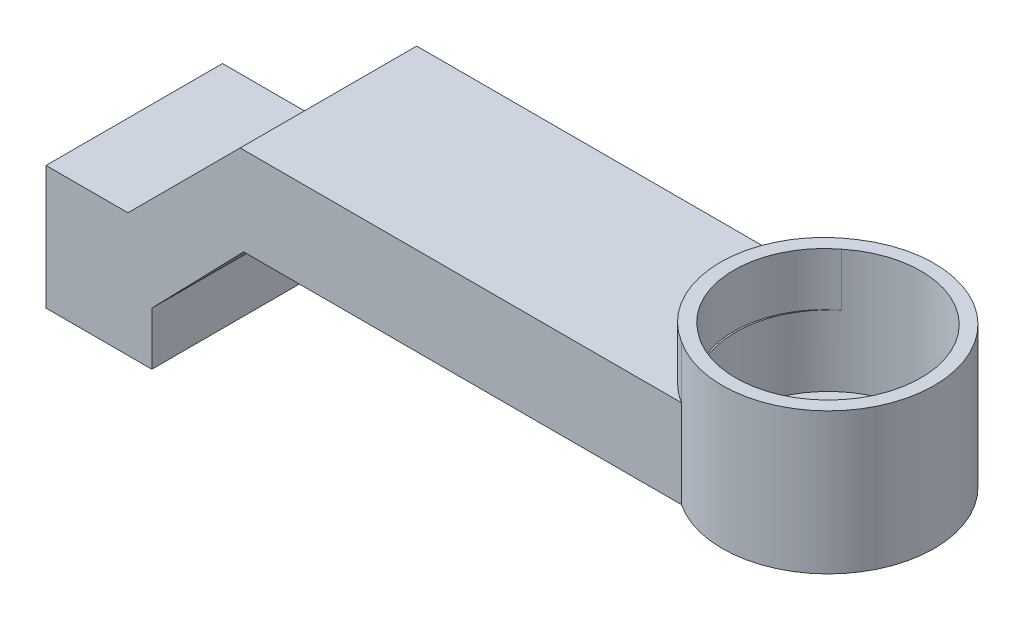
ISO-10303-21;
HEADER;
FILE_DESCRIPTION(('STEP AP214'),'2;1');
FILE_NAME('part.step','',(''),(''),'','','');
FILE_SCHEMA(('AUTOMOTIVE_DESIGN { 1 0 10303 214 1 1 1 1 }'));
ENDSEC;
DATA;
#1=APPLICATION_CONTEXT('core data for automotive mechanical design processes');
#2=APPLICATION_PROTOCOL_DEFINITION('international standard','automotive_design',2000,#1);
#3=PRODUCT_CONTEXT('',#1,'mechanical');
#4=PRODUCT('Part','Part','',(#3));
#5=PRODUCT_RELATED_PRODUCT_CATEGORY('part','',(#4));
#6=PRODUCT_DEFINITION_FORMATION('','',#4);
#7=PRODUCT_DEFINITION_CONTEXT('part definition',#1,'design');
#8=PRODUCT_DEFINITION('design','',#6,#7);
#9=PRODUCT_DEFINITION_SHAPE('','',#8);
#10=(LENGTH_UNIT() NAMED_UNIT(*) SI_UNIT(.MILLI.,.METRE.));
#11=(NAMED_UNIT(*) PLANE_ANGLE_UNIT() SI_UNIT($,.RADIAN.));
#12=(NAMED_UNIT(*) SI_UNIT($,.STERADIAN.) SOLID_ANGLE_UNIT());
#13=UNCERTAINTY_MEASURE_WITH_UNIT(LENGTH_MEASURE(1.E-05),#10,'distance_accuracy_value','');
#14=(GEOMETRIC_REPRESENTATION_CONTEXT(3) GLOBAL_UNCERTAINTY_ASSIGNED_CONTEXT((#13)) GLOBAL_UNIT_ASSIGNED_CONTEXT((#10,
#11,#12)) REPRESENTATION_CONTEXT('',''));
#15=CARTESIAN_POINT('',(0.,0.,0.));
#16=DIRECTION('',(0.,0.,1.));
#17=DIRECTION('',(1.,0.,0.));
#18=AXIS2_PLACEMENT_3D('',#15,#16,#17);
#19=CARTESIAN_POINT('',(6.476,10.358,10.));
#20=DIRECTION('',(0.,-1.,0.));
#21=DIRECTION('',(0.,0.,-1.));
#22=AXIS2_PLACEMENT_3D('',#19,#20,#21);
#23=PLANE('',#22);
#24=CARTESIAN_POINT('',(34.5583141166395,10.358,5.));
#25=DIRECTION('',(0.,1.,0.));
#26=DIRECTION('',(0.,0.,1.));
#27=AXIS2_PLACEMENT_3D('',#24,#25,#26);
#28=CIRCLE('',#27,5.87372627159582);
#29=CARTESIAN_POINT('',(31.476,10.358,0.));
#30=VERTEX_POINT('',#29);
#31=CARTESIAN_POINT('',(31.476,10.358,10.));
#32=VERTEX_POINT('',#31);
#33=EDGE_CURVE('E171',#30,#32,#28,.T.);
#34=ORIENTED_EDGE('',*,*,#33,.F.);
#35=DIRECTION('',(-1.,0.,0.));
#36=VECTOR('',#35,1.);
#37=CARTESIAN_POINT('',(6.476,10.358,0.));
#38=LINE('',#37,#36);
#39=CARTESIAN_POINT('',(6.476,10.358,0.));
#40=VERTEX_POINT('',#39);
#41=EDGE_CURVE('E223',#30,#40,#38,.T.);
#42=ORIENTED_EDGE('',*,*,#41,.T.);
#43=DIRECTION('',(0.,0.,-1.));
#44=VECTOR('',#43,1.);
#45=CARTESIAN_POINT('',(6.476,10.358,10.));
#46=LINE('',#45,#44);
#47=CARTESIAN_POINT('',(6.476,10.358,10.));
#48=VERTEX_POINT('',#47);
#49=EDGE_CURVE('E11',#48,#40,#46,.T.);
#50=ORIENTED_EDGE('',*,*,#49,.F.);
#51=DIRECTION('',(-1.,0.,0.));
#52=VECTOR('',#51,1.);
#53=CARTESIAN_POINT('',(6.476,10.358,10.));
#54=LINE('',#53,#52);
#55=EDGE_CURVE('E216',#32,#48,#54,.T.);
#56=ORIENTED_EDGE('',*,*,#55,.F.);
#57=EDGE_LOOP('',(#34,#42,#50,#56));
#58=FACE_BOUND('',#57,.T.);
#59=ADVANCED_FACE('F34',(#58),#23,.F.);
#60=CARTESIAN_POINT('',(34.5583141166395,10.358,5.));
#61=DIRECTION('',(0.,-1.,0.));
#62=DIRECTION('',(0.,0.,-1.));
#63=AXIS2_PLACEMENT_3D('',#60,#61,#62);
#64=CIRCLE('',#63,5.10520913515156);
#65=CARTESIAN_POINT('',(31.476,10.358,9.06970514902492));
#66=VERTEX_POINT('',#65);
#67=CARTESIAN_POINT('',(31.476,10.358,0.930294850975082));
#68=VERTEX_POINT('',#67);
#69=EDGE_CURVE('E172',#66,#68,#64,.T.);
#70=ORIENTED_EDGE('',*,*,#69,.F.);
#71=CARTESIAN_POINT('',(34.7926247903554,10.358,5.));
#72=DIRECTION('',(0.,-1.,0.));
#73=DIRECTION('',(0.,0.,-1.));
#74=AXIS2_PLACEMENT_3D('',#71,#72,#73);
#75=CIRCLE('',#74,5.25);
#76=EDGE_CURVE('E196',#66,#68,#75,.T.);
#77=ORIENTED_EDGE('',*,*,#76,.T.);
#78=EDGE_LOOP('',(#70,#77));
#79=FACE_BOUND('',#78,.T.);
#80=ADVANCED_FACE('F259',(#79),#23,.F.);
#81=CARTESIAN_POINT('',(31.476,5.358,10.));
#82=DIRECTION('',(0.,1.,0.));
#83=DIRECTION('',(-1.,0.,0.));
#84=AXIS2_PLACEMENT_3D('',#81,#82,#83);
#85=PLANE('',#84);
#86=DIRECTION('',(1.,0.,0.));
#87=VECTOR('',#86,1.);
#88=CARTESIAN_POINT('',(31.476,5.358,0.));
#89=LINE('',#88,#87);
#90=CARTESIAN_POINT('',(6.67147836368865,5.358,0.));
#91=VERTEX_POINT('',#90);
#92=CARTESIAN_POINT('',(31.476,5.358,0.));
#93=VERTEX_POINT('',#92);
#94=EDGE_CURVE('E217',#91,#93,#89,.T.);
#95=ORIENTED_EDGE('',*,*,#94,.T.);
#96=CARTESIAN_POINT('',(34.7926247903554,5.358,5.));
#97=DIRECTION('',(0.,-1.,0.));
#98=DIRECTION('',(-1.,0.,0.));
#99=AXIS2_PLACEMENT_3D('',#96,#97,#98);
#100=CIRCLE('',#99,6.);
#101=CARTESIAN_POINT('',(31.476,5.358,10.));
#102=VERTEX_POINT('',#101);
#103=EDGE_CURVE('E202',#93,#102,#100,.T.);
#104=ORIENTED_EDGE('',*,*,#103,.T.);
#105=DIRECTION('',(1.,0.,0.));
#106=VECTOR('',#105,1.);
#107=CARTESIAN_POINT('',(31.476,5.358,10.));
#108=LINE('',#107,#106);
#109=CARTESIAN_POINT('',(6.67147836368865,5.358,10.));
#110=VERTEX_POINT('',#109);
#111=EDGE_CURVE('E41',#110,#102,#108,.T.);
#112=ORIENTED_EDGE('',*,*,#111,.F.);
#113=DIRECTION('',(0.,0.,1.));
#114=VECTOR('',#113,1.);
#115=CARTESIAN_POINT('',(6.67147836368865,5.358,0.));
#116=LINE('',#115,#114);
#117=EDGE_CURVE('E158',#91,#110,#116,.T.);
#118=ORIENTED_EDGE('',*,*,#117,.F.);
#119=EDGE_LOOP('',(#95,#104,#112,#118));
#120=FACE_BOUND('',#119,.T.);
#121=ADVANCED_FACE('F228',(#120),#85,.F.);
#122=CARTESIAN_POINT('',(0.,0.,10.));
#123=DIRECTION('',(0.,0.,-1.));
#124=DIRECTION('',(-1.,0.,0.));
#125=AXIS2_PLACEMENT_3D('',#122,#123,#124);
#126=PLANE('',#125);
#127=DIRECTION('',(0.,1.,0.));
#128=VECTOR('',#127,1.);
#129=CARTESIAN_POINT('',(-4.524,0.,10.));
#130=LINE('',#129,#128);
#131=CARTESIAN_POINT('',(-4.524,-3.,10.));
#132=VERTEX_POINT('',#131);
#133=CARTESIAN_POINT('',(-4.524,4.,10.));
#134=VERTEX_POINT('',#133);
#135=EDGE_CURVE('E131',#132,#134,#130,.T.);
#136=ORIENTED_EDGE('',*,*,#135,.F.);
#137=DIRECTION('',(-1.,0.,0.));
#138=VECTOR('',#137,1.);
#139=CARTESIAN_POINT('',(-4.524,-3.,10.));
#140=LINE('',#139,#138);
#141=CARTESIAN_POINT('',(1.47450904855389,-3.,10.));
#142=VERTEX_POINT('',#141);
#143=EDGE_CURVE('E146',#142,#132,#140,.T.);
#144=ORIENTED_EDGE('',*,*,#143,.F.);
#145=DIRECTION('',(0.,1.,0.));
#146=VECTOR('',#145,1.);
#147=CARTESIAN_POINT('',(1.47450904855389,-3.,10.));
#148=LINE('',#147,#146);
#149=CARTESIAN_POINT('',(1.47450904855389,0.,10.));
#150=VERTEX_POINT('',#149);
#151=EDGE_CURVE('E151',#142,#150,#148,.T.);
#152=ORIENTED_EDGE('',*,*,#151,.T.);
#153=DIRECTION('',(-0.696237864759615,-0.717811142066611,0.));
#154=VECTOR('',#153,1.);
#155=CARTESIAN_POINT('',(6.67147836368865,5.358,10.));
#156=LINE('',#155,#154);
#157=EDGE_CURVE('E155',#110,#150,#156,.T.);
#158=ORIENTED_EDGE('',*,*,#157,.F.);
#159=ORIENTED_EDGE('',*,*,#111,.T.);
#160=DIRECTION('',(0.,1.,0.));
#161=VECTOR('',#160,1.);
#162=CARTESIAN_POINT('',(31.476,10.358,10.));
#163=LINE('',#162,#161);
#164=EDGE_CURVE('E214',#102,#32,#163,.T.);
#165=ORIENTED_EDGE('',*,*,#164,.T.);
#166=ORIENTED_EDGE('',*,*,#55,.T.);
#167=DIRECTION('',(-0.707106781186544,-0.707106781186551,0.));
#168=VECTOR('',#167,1.);
#169=CARTESIAN_POINT('',(6.476,10.358,10.));
#170=LINE('',#169,#168);
#171=CARTESIAN_POINT('',(0.118000000000064,4.,10.));
#172=VERTEX_POINT('',#171);
#173=EDGE_CURVE('E163',#48,#172,#170,.T.);
#174=ORIENTED_EDGE('',*,*,#173,.T.);
#175=DIRECTION('',(1.,0.,0.));
#176=VECTOR('',#175,1.);
#177=CARTESIAN_POINT('',(-4.524,4.,10.));
#178=LINE('',#177,#176);
#179=EDGE_CURVE('E184',#134,#172,#178,.T.);
#180=ORIENTED_EDGE('',*,*,#179,.F.);
#181=EDGE_LOOP('',(#136,#144,#152,#158,#159,#165,#166,#174,#180));
#182=FACE_BOUND('',#181,.T.);
#183=ADVANCED_FACE('F235',(#182),#126,.F.);
#184=CARTESIAN_POINT('',(0.,0.,0.));
#185=DIRECTION('',(0.,0.,-1.));
#186=DIRECTION('',(-1.,0.,0.));
#187=AXIS2_PLACEMENT_3D('',#184,#185,#186);
#188=PLANE('',#187);
#189=DIRECTION('',(-0.696237864759615,-0.717811142066611,0.));
#190=VECTOR('',#189,1.);
#191=CARTESIAN_POINT('',(6.67147836368865,5.358,0.));
#192=LINE('',#191,#190);
#193=CARTESIAN_POINT('',(1.47450904855389,0.,0.));
#194=VERTEX_POINT('',#193);
#195=EDGE_CURVE('E156',#91,#194,#192,.T.);
#196=ORIENTED_EDGE('',*,*,#195,.T.);
#197=DIRECTION('',(0.,1.,0.));
#198=VECTOR('',#197,1.);
#199=CARTESIAN_POINT('',(1.47450904855389,-3.,0.));
#200=LINE('',#199,#198);
#201=CARTESIAN_POINT('',(1.47450904855389,-3.,0.));
#202=VERTEX_POINT('',#201);
#203=EDGE_CURVE('E138',#202,#194,#200,.T.);
#204=ORIENTED_EDGE('',*,*,#203,.F.);
#205=DIRECTION('',(1.,0.,0.));
#206=VECTOR('',#205,1.);
#207=CARTESIAN_POINT('',(-4.524,-3.,0.));
#208=LINE('',#207,#206);
#209=CARTESIAN_POINT('',(-4.524,-3.,0.));
#210=VERTEX_POINT('',#209);
#211=EDGE_CURVE('E135',#210,#202,#208,.T.);
#212=ORIENTED_EDGE('',*,*,#211,.F.);
#213=DIRECTION('',(0.,-1.,0.));
#214=VECTOR('',#213,1.);
#215=CARTESIAN_POINT('',(-4.524,0.,0.));
#216=LINE('',#215,#214);
#217=CARTESIAN_POINT('',(-4.524,4.,0.));
#218=VERTEX_POINT('',#217);
#219=EDGE_CURVE('E121',#218,#210,#216,.T.);
#220=ORIENTED_EDGE('',*,*,#219,.F.);
#221=DIRECTION('',(1.,0.,0.));
#222=VECTOR('',#221,1.);
#223=CARTESIAN_POINT('',(-4.524,4.,0.));
#224=LINE('',#223,#222);
#225=CARTESIAN_POINT('',(0.118000000000066,4.,0.));
#226=VERTEX_POINT('',#225);
#227=EDGE_CURVE('E182',#218,#226,#224,.T.);
#228=ORIENTED_EDGE('',*,*,#227,.T.);
#229=DIRECTION('',(-0.707106781186544,-0.707106781186551,0.));
#230=VECTOR('',#229,1.);
#231=CARTESIAN_POINT('',(6.476,10.358,0.));
#232=LINE('',#231,#230);
#233=EDGE_CURVE('E47',#40,#226,#232,.T.);
#234=ORIENTED_EDGE('',*,*,#233,.F.);
#235=ORIENTED_EDGE('',*,*,#41,.F.);
#236=DIRECTION('',(0.,1.,0.));
#237=VECTOR('',#236,1.);
#238=CARTESIAN_POINT('',(31.476,10.358,0.));
#239=LINE('',#238,#237);
#240=EDGE_CURVE('E211',#93,#30,#239,.T.);
#241=ORIENTED_EDGE('',*,*,#240,.F.);
#242=ORIENTED_EDGE('',*,*,#94,.F.);
#243=EDGE_LOOP('',(#196,#204,#212,#220,#228,#234,#235,#241,#242));
#244=FACE_BOUND('',#243,.T.);
#245=ADVANCED_FACE('F137',(#244),#188,.T.);
#246=CARTESIAN_POINT('',(34.7926247903554,13.358,5.));
#247=DIRECTION('',(0.,-1.,0.));
#248=DIRECTION('',(1.,0.,0.));
#249=AXIS2_PLACEMENT_3D('',#246,#247,#248);
#250=CYLINDRICAL_SURFACE('',#249,6.);
#251=ORIENTED_EDGE('',*,*,#103,.F.);
#252=ORIENTED_EDGE('',*,*,#240,.T.);
#253=DIRECTION('',(0.,-1.,0.));
#254=VECTOR('',#253,1.);
#255=CARTESIAN_POINT('',(31.476,13.358,0.));
#256=LINE('',#255,#254);
#257=CARTESIAN_POINT('',(31.476,13.358,0.));
#258=VERTEX_POINT('',#257);
#259=EDGE_CURVE('E209',#258,#30,#256,.T.);
#260=ORIENTED_EDGE('',*,*,#259,.F.);
#261=CARTESIAN_POINT('',(34.7926247903554,13.358,5.));
#262=DIRECTION('',(0.,-1.,0.));
#263=DIRECTION('',(-1.,0.,0.));
#264=AXIS2_PLACEMENT_3D('',#261,#262,#263);
#265=CIRCLE('',#264,6.);
#266=CARTESIAN_POINT('',(31.476,13.358,10.));
#267=VERTEX_POINT('',#266);
#268=EDGE_CURVE('E203',#258,#267,#265,.T.);
#269=ORIENTED_EDGE('',*,*,#268,.T.);
#270=DIRECTION('',(0.,-1.,0.));
#271=VECTOR('',#270,1.);
#272=CARTESIAN_POINT('',(31.476,13.358,10.));
#273=LINE('',#272,#271);
#274=EDGE_CURVE('E206',#267,#32,#273,.T.);
#275=ORIENTED_EDGE('',*,*,#274,.T.);
#276=ORIENTED_EDGE('',*,*,#164,.F.);
#277=EDGE_LOOP('',(#251,#252,#260,#269,#275,#276));
#278=FACE_BOUND('',#277,.T.);
#279=ADVANCED_FACE('F234',(#278),#250,.T.);
#280=CARTESIAN_POINT('',(34.7926247903554,13.358,5.));
#281=DIRECTION('',(0.,1.,0.));
#282=DIRECTION('',(-1.,0.,0.));
#283=AXIS2_PLACEMENT_3D('',#280,#281,#282);
#284=PLANE('',#283);
#285=ORIENTED_EDGE('',*,*,#268,.F.);
#286=CARTESIAN_POINT('',(34.5583141166395,13.358,5.));
#287=DIRECTION('',(0.,1.,0.));
#288=DIRECTION('',(-1.,0.,0.));
#289=AXIS2_PLACEMENT_3D('',#286,#287,#288);
#290=CIRCLE('',#289,5.87372627159582);
#291=EDGE_CURVE('E132',#258,#267,#290,.T.);
#292=ORIENTED_EDGE('',*,*,#291,.T.);
#293=EDGE_LOOP('',(#285,#292));
#294=FACE_BOUND('',#293,.T.);
#295=CARTESIAN_POINT('',(34.7926247903554,13.358,5.));
#296=DIRECTION('',(0.,1.,0.));
#297=DIRECTION('',(-1.,0.,0.));
#298=AXIS2_PLACEMENT_3D('',#295,#296,#297);
#299=CIRCLE('',#298,5.25);
#300=CARTESIAN_POINT('',(31.476,13.358,9.06970514902492));
#301=VERTEX_POINT('',#300);
#302=CARTESIAN_POINT('',(31.476,13.358,0.930294850975082));
#303=VERTEX_POINT('',#302);
#304=EDGE_CURVE('E187',#301,#303,#299,.T.);
#305=ORIENTED_EDGE('',*,*,#304,.F.);
#306=CARTESIAN_POINT('',(34.5583141166395,13.358,5.));
#307=DIRECTION('',(0.,1.,0.));
#308=DIRECTION('',(-1.,0.,0.));
#309=AXIS2_PLACEMENT_3D('',#306,#307,#308);
#310=CIRCLE('',#309,5.10520913515156);
#311=EDGE_CURVE('E174',#301,#303,#310,.F.);
#312=ORIENTED_EDGE('',*,*,#311,.T.);
#313=EDGE_LOOP('',(#305,#312));
#314=FACE_BOUND('',#313,.T.);
#315=ADVANCED_FACE('F276',(#294,#314),#284,.T.);
#316=CARTESIAN_POINT('',(34.7926247903554,6.358,5.));
#317=DIRECTION('',(0.,1.,0.));
#318=DIRECTION('',(-1.,0.,0.));
#319=AXIS2_PLACEMENT_3D('',#316,#317,#318);
#320=CYLINDRICAL_SURFACE('',#319,5.25);
#321=DIRECTION('',(0.,1.,0.));
#322=VECTOR('',#321,1.);
#323=CARTESIAN_POINT('',(31.476,6.358,9.06970514902492));
#324=LINE('',#323,#322);
#325=EDGE_CURVE('E199',#66,#301,#324,.T.);
#326=ORIENTED_EDGE('',*,*,#325,.T.);
#327=ORIENTED_EDGE('',*,*,#304,.T.);
#328=DIRECTION('',(0.,1.,0.));
#329=VECTOR('',#328,1.);
#330=CARTESIAN_POINT('',(31.476,6.358,0.930294850975082));
#331=LINE('',#330,#329);
#332=EDGE_CURVE('E191',#303,#68,#331,.F.);
#333=ORIENTED_EDGE('',*,*,#332,.T.);
#334=ORIENTED_EDGE('',*,*,#76,.F.);
#335=EDGE_LOOP('',(#326,#327,#333,#334));
#336=FACE_BOUND('',#335,.T.);
#337=CARTESIAN_POINT('',(34.7926247903554,6.358,5.));
#338=DIRECTION('',(0.,1.,0.));
#339=DIRECTION('',(-1.,0.,0.));
#340=AXIS2_PLACEMENT_3D('',#337,#338,#339);
#341=CIRCLE('',#340,5.25);
#342=CARTESIAN_POINT('',(29.5426247903554,6.358,5.));
#343=VERTEX_POINT('',#342);
#344=EDGE_CURVE('E188',#343,#343,#341,.T.);
#345=ORIENTED_EDGE('',*,*,#344,.F.);
#346=EDGE_LOOP('',(#345));
#347=FACE_BOUND('',#346,.T.);
#348=ADVANCED_FACE('F271',(#336,#347),#320,.F.);
#349=CARTESIAN_POINT('',(34.7926247903554,6.358,5.));
#350=DIRECTION('',(0.,1.,0.));
#351=DIRECTION('',(-1.,0.,0.));
#352=AXIS2_PLACEMENT_3D('',#349,#350,#351);
#353=PLANE('',#352);
#354=ORIENTED_EDGE('',*,*,#344,.T.);
#355=EDGE_LOOP('',(#354));
#356=FACE_BOUND('',#355,.T.);
#357=ADVANCED_FACE('F284',(#356),#353,.T.);
#358=CARTESIAN_POINT('',(-4.524,4.,0.));
#359=DIRECTION('',(0.,-1.,0.));
#360=DIRECTION('',(1.,0.,0.));
#361=AXIS2_PLACEMENT_3D('',#358,#359,#360);
#362=PLANE('',#361);
#363=ORIENTED_EDGE('',*,*,#179,.T.);
#364=DIRECTION('',(0.,0.,1.));
#365=VECTOR('',#364,1.);
#366=CARTESIAN_POINT('',(0.118000000000064,4.,-8.99156982956809));
#367=LINE('',#366,#365);
#368=EDGE_CURVE('E169',#226,#172,#367,.T.);
#369=ORIENTED_EDGE('',*,*,#368,.F.);
#370=ORIENTED_EDGE('',*,*,#227,.F.);
#371=DIRECTION('',(0.,0.,-1.));
#372=VECTOR('',#371,1.);
#373=CARTESIAN_POINT('',(-4.524,4.,0.));
#374=LINE('',#373,#372);
#375=EDGE_CURVE('E127',#134,#218,#374,.T.);
#376=ORIENTED_EDGE('',*,*,#375,.F.);
#377=EDGE_LOOP('',(#363,#369,#370,#376));
#378=FACE_BOUND('',#377,.T.);
#379=ADVANCED_FACE('F243',(#378),#362,.F.);
#380=CARTESIAN_POINT('',(-4.524,0.,0.));
#381=DIRECTION('',(1.,0.,0.));
#382=DIRECTION('',(0.,0.,-1.));
#383=AXIS2_PLACEMENT_3D('',#380,#381,#382);
#384=PLANE('',#383);
#385=ORIENTED_EDGE('',*,*,#219,.T.);
#386=DIRECTION('',(0.,0.,-1.));
#387=VECTOR('',#386,1.);
#388=CARTESIAN_POINT('',(-4.524,-3.,10.));
#389=LINE('',#388,#387);
#390=EDGE_CURVE('E125',#132,#210,#389,.T.);
#391=ORIENTED_EDGE('',*,*,#390,.F.);
#392=ORIENTED_EDGE('',*,*,#135,.T.);
#393=ORIENTED_EDGE('',*,*,#375,.T.);
#394=EDGE_LOOP('',(#385,#391,#392,#393));
#395=FACE_BOUND('',#394,.T.);
#396=ADVANCED_FACE('F123',(#395),#384,.F.);
#397=CARTESIAN_POINT('',(34.5583141166395,23.7402917421366,5.));
#398=DIRECTION('',(0.,-1.,0.));
#399=DIRECTION('',(0.,0.,-1.));
#400=AXIS2_PLACEMENT_3D('',#397,#398,#399);
#401=CYLINDRICAL_SURFACE('',#400,5.87372627159582);
#402=ORIENTED_EDGE('',*,*,#291,.F.);
#403=ORIENTED_EDGE('',*,*,#259,.T.);
#404=ORIENTED_EDGE('',*,*,#33,.T.);
#405=ORIENTED_EDGE('',*,*,#274,.F.);
#406=EDGE_LOOP('',(#402,#403,#404,#405));
#407=FACE_BOUND('',#406,.T.);
#408=ADVANCED_FACE('F326',(#407),#401,.T.);
#409=CARTESIAN_POINT('',(34.5583141166395,23.7402917421366,5.));
#410=DIRECTION('',(0.,-1.,0.));
#411=DIRECTION('',(0.,0.,-1.));
#412=AXIS2_PLACEMENT_3D('',#409,#410,#411);
#413=CYLINDRICAL_SURFACE('',#412,5.10520913515156);
#414=ORIENTED_EDGE('',*,*,#311,.F.);
#415=ORIENTED_EDGE('',*,*,#325,.F.);
#416=ORIENTED_EDGE('',*,*,#69,.T.);
#417=ORIENTED_EDGE('',*,*,#332,.F.);
#418=EDGE_LOOP('',(#414,#415,#416,#417));
#419=FACE_BOUND('',#418,.T.);
#420=ADVANCED_FACE('F274',(#419),#413,.F.);
#421=CARTESIAN_POINT('',(6.476,10.358,-8.99156982956809));
#422=DIRECTION('',(-0.707106781186551,0.707106781186544,0.));
#423=DIRECTION('',(-0.707106781186544,-0.707106781186551,0.));
#424=AXIS2_PLACEMENT_3D('',#421,#422,#423);
#425=PLANE('',#424);
#426=ORIENTED_EDGE('',*,*,#49,.T.);
#427=ORIENTED_EDGE('',*,*,#233,.T.);
#428=ORIENTED_EDGE('',*,*,#368,.T.);
#429=ORIENTED_EDGE('',*,*,#173,.F.);
#430=EDGE_LOOP('',(#426,#427,#428,#429));
#431=FACE_BOUND('',#430,.T.);
#432=ADVANCED_FACE('F241',(#431),#425,.T.);
#433=CARTESIAN_POINT('',(6.67147836368865,5.358,0.));
#434=DIRECTION('',(-0.717811142066611,0.696237864759615,0.));
#435=DIRECTION('',(-0.696237864759615,-0.717811142066611,0.));
#436=AXIS2_PLACEMENT_3D('',#433,#434,#435);
#437=PLANE('',#436);
#438=ORIENTED_EDGE('',*,*,#157,.T.);
#439=DIRECTION('',(0.,0.,1.));
#440=VECTOR('',#439,1.);
#441=CARTESIAN_POINT('',(1.47450904855389,0.,0.));
#442=LINE('',#441,#440);
#443=EDGE_CURVE('E161',#194,#150,#442,.T.);
#444=ORIENTED_EDGE('',*,*,#443,.F.);
#445=ORIENTED_EDGE('',*,*,#195,.F.);
#446=ORIENTED_EDGE('',*,*,#117,.T.);
#447=EDGE_LOOP('',(#438,#444,#445,#446));
#448=FACE_BOUND('',#447,.T.);
#449=ADVANCED_FACE('F248',(#448),#437,.F.);
#450=CARTESIAN_POINT('',(1.47450904855389,-3.,10.));
#451=DIRECTION('',(-1.,0.,0.));
#452=DIRECTION('',(0.,0.,1.));
#453=AXIS2_PLACEMENT_3D('',#450,#451,#452);
#454=PLANE('',#453);
#455=ORIENTED_EDGE('',*,*,#443,.T.);
#456=ORIENTED_EDGE('',*,*,#151,.F.);
#457=DIRECTION('',(0.,0.,1.));
#458=VECTOR('',#457,1.);
#459=CARTESIAN_POINT('',(1.47450904855389,-3.,10.));
#460=LINE('',#459,#458);
#461=EDGE_CURVE('E141',#202,#142,#460,.T.);
#462=ORIENTED_EDGE('',*,*,#461,.F.);
#463=ORIENTED_EDGE('',*,*,#203,.T.);
#464=EDGE_LOOP('',(#455,#456,#462,#463));
#465=FACE_BOUND('',#464,.T.);
#466=ADVANCED_FACE('F249',(#465),#454,.F.);
#467=CARTESIAN_POINT('',(0.,-3.,0.));
#468=DIRECTION('',(0.,-1.,0.));
#469=DIRECTION('',(0.,0.,-1.));
#470=AXIS2_PLACEMENT_3D('',#467,#468,#469);
#471=PLANE('',#470);
#472=ORIENTED_EDGE('',*,*,#390,.T.);
#473=ORIENTED_EDGE('',*,*,#211,.T.);
#474=ORIENTED_EDGE('',*,*,#461,.T.);
#475=ORIENTED_EDGE('',*,*,#143,.T.);
#476=EDGE_LOOP('',(#472,#473,#474,#475));
#477=FACE_BOUND('',#476,.T.);
#478=ADVANCED_FACE('F144',(#477),#471,.T.);
#479=CLOSED_SHELL('',(#59,#80,#121,#183,#245,#279,#315,#348,#357,#379,#396,#408,#420,#432,#449,
#466,#478));
#480=MANIFOLD_SOLID_BREP('B2',#479);
#481=ADVANCED_BREP_SHAPE_REPRESENTATION('',(#18,#480),#14);
#482=SHAPE_DEFINITION_REPRESENTATION(#9,#481);
ENDSEC;
END-ISO-10303-21;
